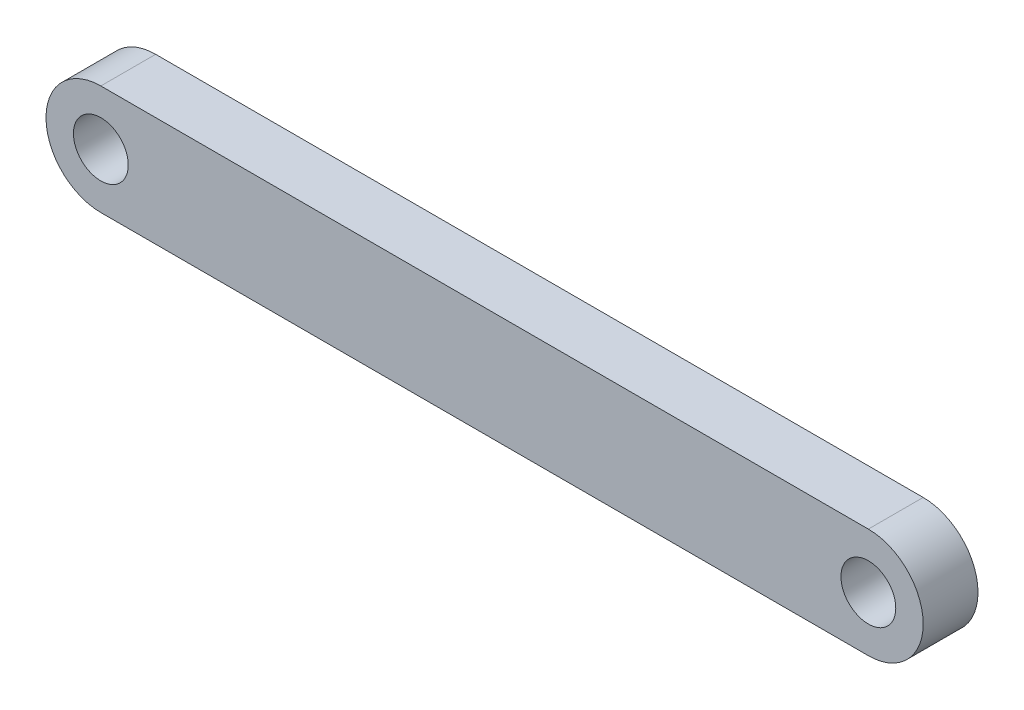
ISO-10303-21;
HEADER;
FILE_DESCRIPTION(('STEP AP214'),'2;1');
FILE_NAME('part.step','',(''),(''),'','','');
FILE_SCHEMA(('AUTOMOTIVE_DESIGN { 1 0 10303 214 1 1 1 1 }'));
ENDSEC;
DATA;
#1=APPLICATION_CONTEXT('core data for automotive mechanical design processes');
#2=APPLICATION_PROTOCOL_DEFINITION('international standard','automotive_design',2000,#1);
#3=PRODUCT_CONTEXT('',#1,'mechanical');
#4=PRODUCT('Part','Part','',(#3));
#5=PRODUCT_RELATED_PRODUCT_CATEGORY('part','',(#4));
#6=PRODUCT_DEFINITION_FORMATION('','',#4);
#7=PRODUCT_DEFINITION_CONTEXT('part definition',#1,'design');
#8=PRODUCT_DEFINITION('design','',#6,#7);
#9=PRODUCT_DEFINITION_SHAPE('','',#8);
#10=(LENGTH_UNIT() NAMED_UNIT(*) SI_UNIT(.MILLI.,.METRE.));
#11=(NAMED_UNIT(*) PLANE_ANGLE_UNIT() SI_UNIT($,.RADIAN.));
#12=(NAMED_UNIT(*) SI_UNIT($,.STERADIAN.) SOLID_ANGLE_UNIT());
#13=UNCERTAINTY_MEASURE_WITH_UNIT(LENGTH_MEASURE(1.E-05),#10,'distance_accuracy_value','');
#14=(GEOMETRIC_REPRESENTATION_CONTEXT(3) GLOBAL_UNCERTAINTY_ASSIGNED_CONTEXT((#13)) GLOBAL_UNIT_ASSIGNED_CONTEXT((#10,
#11,#12)) REPRESENTATION_CONTEXT('',''));
#15=CARTESIAN_POINT('',(0.,0.,0.));
#16=DIRECTION('',(0.,0.,1.));
#17=DIRECTION('',(1.,0.,0.));
#18=AXIS2_PLACEMENT_3D('',#15,#16,#17);
#19=CARTESIAN_POINT('',(-69.2213172426299,22.9861947261588,2.5));
#20=DIRECTION('',(0.,0.,-1.));
#21=DIRECTION('',(-1.,0.,0.));
#22=AXIS2_PLACEMENT_3D('',#19,#20,#21);
#23=CYLINDRICAL_SURFACE('',#22,5.);
#24=CARTESIAN_POINT('',(-69.2213172426299,22.9861947261588,-2.5));
#25=DIRECTION('',(0.,0.,1.));
#26=DIRECTION('',(1.,0.,0.));
#27=AXIS2_PLACEMENT_3D('',#24,#25,#26);
#28=CIRCLE('',#27,5.);
#29=CARTESIAN_POINT('',(-69.2213172426299,27.9861947261588,-2.5));
#30=VERTEX_POINT('',#29);
#31=CARTESIAN_POINT('',(-69.2213172426299,17.9861947261588,-2.5));
#32=VERTEX_POINT('',#31);
#33=EDGE_CURVE('E107',#30,#32,#28,.T.);
#34=ORIENTED_EDGE('',*,*,#33,.T.);
#35=DIRECTION('',(0.,0.,-1.));
#36=VECTOR('',#35,1.);
#37=CARTESIAN_POINT('',(-69.2213172426299,17.9861947261588,2.5));
#38=LINE('',#37,#36);
#39=CARTESIAN_POINT('',(-69.2213172426299,17.9861947261588,2.5));
#40=VERTEX_POINT('',#39);
#41=EDGE_CURVE('E11',#40,#32,#38,.T.);
#42=ORIENTED_EDGE('',*,*,#41,.F.);
#43=CARTESIAN_POINT('',(-69.2213172426299,22.9861947261588,2.5));
#44=DIRECTION('',(0.,0.,1.));
#45=DIRECTION('',(1.,0.,0.));
#46=AXIS2_PLACEMENT_3D('',#43,#44,#45);
#47=CIRCLE('',#46,5.);
#48=CARTESIAN_POINT('',(-69.2213172426299,27.9861947261588,2.5));
#49=VERTEX_POINT('',#48);
#50=EDGE_CURVE('E94',#49,#40,#47,.T.);
#51=ORIENTED_EDGE('',*,*,#50,.F.);
#52=DIRECTION('',(0.,0.,-1.));
#53=VECTOR('',#52,1.);
#54=CARTESIAN_POINT('',(-69.2213172426299,27.9861947261588,2.5));
#55=LINE('',#54,#53);
#56=EDGE_CURVE('E103',#49,#30,#55,.T.);
#57=ORIENTED_EDGE('',*,*,#56,.T.);
#58=EDGE_LOOP('',(#34,#42,#51,#57));
#59=FACE_BOUND('',#58,.T.);
#60=ADVANCED_FACE('F41',(#59),#23,.T.);
#61=CARTESIAN_POINT('',(-69.2213172426299,17.9861947261588,2.5));
#62=DIRECTION('',(0.,1.,0.));
#63=DIRECTION('',(0.,0.,1.));
#64=AXIS2_PLACEMENT_3D('',#61,#62,#63);
#65=PLANE('',#64);
#66=DIRECTION('',(1.,0.,0.));
#67=VECTOR('',#66,1.);
#68=CARTESIAN_POINT('',(-69.2213172426299,17.9861947261588,-2.5));
#69=LINE('',#68,#67);
#70=CARTESIAN_POINT('',(0.778682757370142,17.9861947261588,-2.5));
#71=VERTEX_POINT('',#70);
#72=EDGE_CURVE('E98',#32,#71,#69,.T.);
#73=ORIENTED_EDGE('',*,*,#72,.T.);
#74=DIRECTION('',(0.,0.,-1.));
#75=VECTOR('',#74,1.);
#76=CARTESIAN_POINT('',(0.778682757370142,17.9861947261588,2.5));
#77=LINE('',#76,#75);
#78=CARTESIAN_POINT('',(0.778682757370142,17.9861947261588,2.5));
#79=VERTEX_POINT('',#78);
#80=EDGE_CURVE('E50',#79,#71,#77,.T.);
#81=ORIENTED_EDGE('',*,*,#80,.F.);
#82=DIRECTION('',(1.,0.,0.));
#83=VECTOR('',#82,1.);
#84=CARTESIAN_POINT('',(-69.2213172426299,17.9861947261588,2.5));
#85=LINE('',#84,#83);
#86=EDGE_CURVE('E89',#40,#79,#85,.T.);
#87=ORIENTED_EDGE('',*,*,#86,.F.);
#88=ORIENTED_EDGE('',*,*,#41,.T.);
#89=EDGE_LOOP('',(#73,#81,#87,#88));
#90=FACE_BOUND('',#89,.T.);
#91=ADVANCED_FACE('F97',(#90),#65,.F.);
#92=CARTESIAN_POINT('',(0.778682757370142,22.9861947261588,2.5));
#93=DIRECTION('',(0.,0.,-1.));
#94=DIRECTION('',(-1.,0.,0.));
#95=AXIS2_PLACEMENT_3D('',#92,#93,#94);
#96=CYLINDRICAL_SURFACE('',#95,5.);
#97=CARTESIAN_POINT('',(0.778682757370142,22.9861947261588,-2.5));
#98=DIRECTION('',(0.,0.,1.));
#99=DIRECTION('',(-1.,0.,0.));
#100=AXIS2_PLACEMENT_3D('',#97,#98,#99);
#101=CIRCLE('',#100,5.);
#102=CARTESIAN_POINT('',(0.778682757370142,27.9861947261588,-2.5));
#103=VERTEX_POINT('',#102);
#104=EDGE_CURVE('E76',#71,#103,#101,.T.);
#105=ORIENTED_EDGE('',*,*,#104,.T.);
#106=DIRECTION('',(0.,0.,-1.));
#107=VECTOR('',#106,1.);
#108=CARTESIAN_POINT('',(0.778682757370142,27.9861947261588,2.5));
#109=LINE('',#108,#107);
#110=CARTESIAN_POINT('',(0.778682757370142,27.9861947261588,2.5));
#111=VERTEX_POINT('',#110);
#112=EDGE_CURVE('E99',#111,#103,#109,.T.);
#113=ORIENTED_EDGE('',*,*,#112,.F.);
#114=CARTESIAN_POINT('',(0.778682757370142,22.9861947261588,2.5));
#115=DIRECTION('',(0.,0.,1.));
#116=DIRECTION('',(-1.,0.,0.));
#117=AXIS2_PLACEMENT_3D('',#114,#115,#116);
#118=CIRCLE('',#117,5.);
#119=EDGE_CURVE('E92',#79,#111,#118,.T.);
#120=ORIENTED_EDGE('',*,*,#119,.F.);
#121=ORIENTED_EDGE('',*,*,#80,.T.);
#122=EDGE_LOOP('',(#105,#113,#120,#121));
#123=FACE_BOUND('',#122,.T.);
#124=ADVANCED_FACE('F101',(#123),#96,.T.);
#125=CARTESIAN_POINT('',(-69.2213172426299,27.9861947261588,2.5));
#126=DIRECTION('',(0.,-1.,0.));
#127=DIRECTION('',(1.,0.,0.));
#128=AXIS2_PLACEMENT_3D('',#125,#126,#127);
#129=PLANE('',#128);
#130=DIRECTION('',(-1.,0.,0.));
#131=VECTOR('',#130,1.);
#132=CARTESIAN_POINT('',(-69.2213172426299,27.9861947261588,-2.5));
#133=LINE('',#132,#131);
#134=EDGE_CURVE('E82',#103,#30,#133,.T.);
#135=ORIENTED_EDGE('',*,*,#134,.T.);
#136=ORIENTED_EDGE('',*,*,#56,.F.);
#137=DIRECTION('',(-1.,0.,0.));
#138=VECTOR('',#137,1.);
#139=CARTESIAN_POINT('',(-69.2213172426299,27.9861947261588,2.5));
#140=LINE('',#139,#138);
#141=EDGE_CURVE('E59',#111,#49,#140,.T.);
#142=ORIENTED_EDGE('',*,*,#141,.F.);
#143=ORIENTED_EDGE('',*,*,#112,.T.);
#144=EDGE_LOOP('',(#135,#136,#142,#143));
#145=FACE_BOUND('',#144,.T.);
#146=ADVANCED_FACE('F135',(#145),#129,.F.);
#147=CARTESIAN_POINT('',(-69.2213172426299,22.9861947261588,2.5));
#148=DIRECTION('',(0.,0.,1.));
#149=DIRECTION('',(1.,0.,0.));
#150=AXIS2_PLACEMENT_3D('',#147,#148,#149);
#151=PLANE('',#150);
#152=CARTESIAN_POINT('',(0.778682757370142,22.9861947261588,2.5));
#153=DIRECTION('',(0.,0.,1.));
#154=DIRECTION('',(1.,0.,0.));
#155=AXIS2_PLACEMENT_3D('',#152,#153,#154);
#156=CIRCLE('',#155,2.5);
#157=CARTESIAN_POINT('',(3.27868275737014,22.9861947261588,2.5));
#158=VERTEX_POINT('',#157);
#159=EDGE_CURVE('E124',#158,#158,#156,.T.);
#160=ORIENTED_EDGE('',*,*,#159,.F.);
#161=EDGE_LOOP('',(#160));
#162=FACE_BOUND('',#161,.T.);
#163=CARTESIAN_POINT('',(-69.2213172426299,22.9861947261588,2.5));
#164=DIRECTION('',(0.,0.,1.));
#165=DIRECTION('',(1.,0.,0.));
#166=AXIS2_PLACEMENT_3D('',#163,#164,#165);
#167=CIRCLE('',#166,2.5);
#168=CARTESIAN_POINT('',(-66.7213172426299,22.9861947261588,2.5));
#169=VERTEX_POINT('',#168);
#170=EDGE_CURVE('E116',#169,#169,#167,.T.);
#171=ORIENTED_EDGE('',*,*,#170,.F.);
#172=EDGE_LOOP('',(#171));
#173=FACE_BOUND('',#172,.T.);
#174=ORIENTED_EDGE('',*,*,#50,.T.);
#175=ORIENTED_EDGE('',*,*,#86,.T.);
#176=ORIENTED_EDGE('',*,*,#119,.T.);
#177=ORIENTED_EDGE('',*,*,#141,.T.);
#178=EDGE_LOOP('',(#174,#175,#176,#177));
#179=FACE_BOUND('',#178,.T.);
#180=ADVANCED_FACE('F90',(#162,#173,#179),#151,.T.);
#181=CARTESIAN_POINT('',(-69.2213172426299,22.9861947261588,-2.5));
#182=DIRECTION('',(0.,0.,1.));
#183=DIRECTION('',(1.,0.,0.));
#184=AXIS2_PLACEMENT_3D('',#181,#182,#183);
#185=PLANE('',#184);
#186=CARTESIAN_POINT('',(0.778682757370142,22.9861947261588,-2.5));
#187=DIRECTION('',(0.,0.,1.));
#188=DIRECTION('',(1.,0.,0.));
#189=AXIS2_PLACEMENT_3D('',#186,#187,#188);
#190=CIRCLE('',#189,2.5);
#191=CARTESIAN_POINT('',(3.27868275737014,22.9861947261588,-2.5));
#192=VERTEX_POINT('',#191);
#193=EDGE_CURVE('E44',#192,#192,#190,.T.);
#194=ORIENTED_EDGE('',*,*,#193,.T.);
#195=EDGE_LOOP('',(#194));
#196=FACE_BOUND('',#195,.T.);
#197=CARTESIAN_POINT('',(-69.2213172426299,22.9861947261588,-2.5));
#198=DIRECTION('',(0.,0.,1.));
#199=DIRECTION('',(1.,0.,0.));
#200=AXIS2_PLACEMENT_3D('',#197,#198,#199);
#201=CIRCLE('',#200,2.5);
#202=CARTESIAN_POINT('',(-66.7213172426299,22.9861947261588,-2.5));
#203=VERTEX_POINT('',#202);
#204=EDGE_CURVE('E110',#203,#203,#201,.T.);
#205=ORIENTED_EDGE('',*,*,#204,.T.);
#206=EDGE_LOOP('',(#205));
#207=FACE_BOUND('',#206,.T.);
#208=ORIENTED_EDGE('',*,*,#33,.F.);
#209=ORIENTED_EDGE('',*,*,#134,.F.);
#210=ORIENTED_EDGE('',*,*,#104,.F.);
#211=ORIENTED_EDGE('',*,*,#72,.F.);
#212=EDGE_LOOP('',(#208,#209,#210,#211));
#213=FACE_BOUND('',#212,.T.);
#214=ADVANCED_FACE('F134',(#196,#207,#213),#185,.F.);
#215=CARTESIAN_POINT('',(-69.2213172426299,22.9861947261588,-5.5));
#216=DIRECTION('',(0.,0.,1.));
#217=DIRECTION('',(1.,0.,0.));
#218=AXIS2_PLACEMENT_3D('',#215,#216,#217);
#219=CYLINDRICAL_SURFACE('',#218,2.5);
#220=ORIENTED_EDGE('',*,*,#170,.T.);
#221=EDGE_LOOP('',(#220));
#222=FACE_BOUND('',#221,.T.);
#223=ORIENTED_EDGE('',*,*,#204,.F.);
#224=EDGE_LOOP('',(#223));
#225=FACE_BOUND('',#224,.T.);
#226=ADVANCED_FACE('F141',(#222,#225),#219,.F.);
#227=CARTESIAN_POINT('',(0.778682757370142,22.9861947261588,-5.5));
#228=DIRECTION('',(0.,0.,1.));
#229=DIRECTION('',(1.,0.,0.));
#230=AXIS2_PLACEMENT_3D('',#227,#228,#229);
#231=CYLINDRICAL_SURFACE('',#230,2.5);
#232=ORIENTED_EDGE('',*,*,#159,.T.);
#233=EDGE_LOOP('',(#232));
#234=FACE_BOUND('',#233,.T.);
#235=ORIENTED_EDGE('',*,*,#193,.F.);
#236=EDGE_LOOP('',(#235));
#237=FACE_BOUND('',#236,.T.);
#238=ADVANCED_FACE('F129',(#234,#237),#231,.F.);
#239=CLOSED_SHELL('',(#60,#91,#124,#146,#180,#214,#226,#238));
#240=MANIFOLD_SOLID_BREP('B2',#239);
#241=ADVANCED_BREP_SHAPE_REPRESENTATION('',(#18,#240),#14);
#242=SHAPE_DEFINITION_REPRESENTATION(#9,#241);
ENDSEC;
END-ISO-10303-21;
